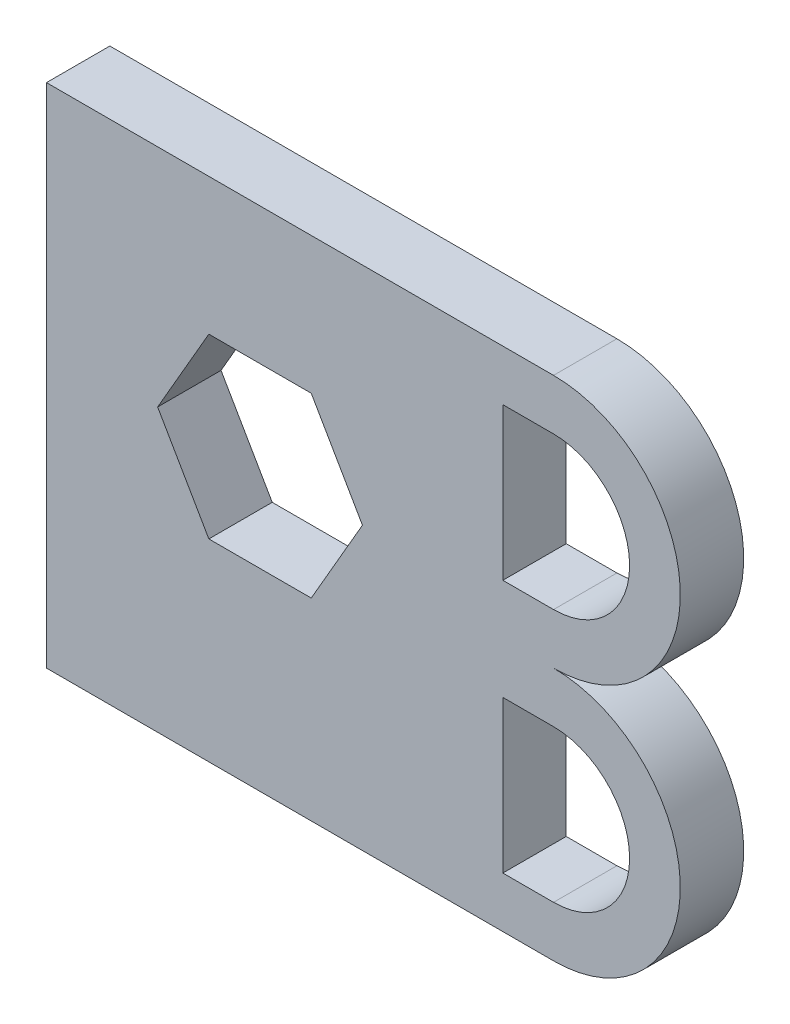
ISO-10303-21;
HEADER;
FILE_DESCRIPTION(('STEP AP214'),'2;1');
FILE_NAME('part.step','',(''),(''),'','','');
FILE_SCHEMA(('AUTOMOTIVE_DESIGN { 1 0 10303 214 1 1 1 1 }'));
ENDSEC;
DATA;
#1=APPLICATION_CONTEXT('core data for automotive mechanical design processes');
#2=APPLICATION_PROTOCOL_DEFINITION('international standard','automotive_design',2000,#1);
#3=PRODUCT_CONTEXT('',#1,'mechanical');
#4=PRODUCT('Part','Part','',(#3));
#5=PRODUCT_RELATED_PRODUCT_CATEGORY('part','',(#4));
#6=PRODUCT_DEFINITION_FORMATION('','',#4);
#7=PRODUCT_DEFINITION_CONTEXT('part definition',#1,'design');
#8=PRODUCT_DEFINITION('design','',#6,#7);
#9=PRODUCT_DEFINITION_SHAPE('','',#8);
#10=(LENGTH_UNIT() NAMED_UNIT(*) SI_UNIT(.MILLI.,.METRE.));
#11=(NAMED_UNIT(*) PLANE_ANGLE_UNIT() SI_UNIT($,.RADIAN.));
#12=(NAMED_UNIT(*) SI_UNIT($,.STERADIAN.) SOLID_ANGLE_UNIT());
#13=UNCERTAINTY_MEASURE_WITH_UNIT(LENGTH_MEASURE(1.E-05),#10,'distance_accuracy_value','');
#14=(GEOMETRIC_REPRESENTATION_CONTEXT(3) GLOBAL_UNCERTAINTY_ASSIGNED_CONTEXT((#13)) GLOBAL_UNIT_ASSIGNED_CONTEXT((#10,
#11,#12)) REPRESENTATION_CONTEXT('',''));
#15=CARTESIAN_POINT('',(0.,0.,0.));
#16=DIRECTION('',(0.,0.,1.));
#17=DIRECTION('',(1.,0.,0.));
#18=AXIS2_PLACEMENT_3D('',#15,#16,#17);
#19=CARTESIAN_POINT('',(80.,60.,10.));
#20=DIRECTION('',(0.,0.,-1.));
#21=DIRECTION('',(-1.,0.,0.));
#22=AXIS2_PLACEMENT_3D('',#19,#20,#21);
#23=PLANE('',#22);
#24=DIRECTION('',(-0.500000000000001,0.866025403784438,0.));
#25=VECTOR('',#24,1.);
#26=CARTESIAN_POINT('',(49.8504126900264,44.4502224717156,10.));
#27=LINE('',#26,#25);
#28=CARTESIAN_POINT('',(49.8504126900264,44.4502224717156,10.));
#29=VERTEX_POINT('',#28);
#30=CARTESIAN_POINT('',(41.7726979514501,58.4412348079776,10.));
#31=VERTEX_POINT('',#30);
#32=EDGE_CURVE('E197',#29,#31,#27,.T.);
#33=ORIENTED_EDGE('',*,*,#32,.F.);
#34=DIRECTION('',(0.499999999999995,0.866025403784441,0.));
#35=VECTOR('',#34,1.);
#36=CARTESIAN_POINT('',(41.7726979514503,30.4592101354538,10.));
#37=LINE('',#36,#35);
#38=CARTESIAN_POINT('',(41.7726979514503,30.4592101354538,10.));
#39=VERTEX_POINT('',#38);
#40=EDGE_CURVE('E48',#39,#29,#37,.T.);
#41=ORIENTED_EDGE('',*,*,#40,.F.);
#42=DIRECTION('',(1.,0.,0.));
#43=VECTOR('',#42,1.);
#44=CARTESIAN_POINT('',(25.6172684742979,30.4592101354536,10.));
#45=LINE('',#44,#43);
#46=CARTESIAN_POINT('',(25.6172684742979,30.4592101354536,10.));
#47=VERTEX_POINT('',#46);
#48=EDGE_CURVE('E183',#47,#39,#45,.T.);
#49=ORIENTED_EDGE('',*,*,#48,.F.);
#50=DIRECTION('',(0.500000000000007,-0.866025403784435,0.));
#51=VECTOR('',#50,1.);
#52=CARTESIAN_POINT('',(17.5395537357216,44.4502224717155,10.));
#53=LINE('',#52,#51);
#54=CARTESIAN_POINT('',(17.5395537357216,44.4502224717155,10.));
#55=VERTEX_POINT('',#54);
#56=EDGE_CURVE('E186',#55,#47,#53,.T.);
#57=ORIENTED_EDGE('',*,*,#56,.F.);
#58=DIRECTION('',(-0.499999999999995,-0.866025403784442,0.));
#59=VECTOR('',#58,1.);
#60=CARTESIAN_POINT('',(25.6172684742977,58.4412348079775,10.));
#61=LINE('',#60,#59);
#62=CARTESIAN_POINT('',(25.6172684742977,58.4412348079775,10.));
#63=VERTEX_POINT('',#62);
#64=EDGE_CURVE('E202',#63,#55,#61,.T.);
#65=ORIENTED_EDGE('',*,*,#64,.F.);
#66=DIRECTION('',(-1.,0.,0.));
#67=VECTOR('',#66,1.);
#68=CARTESIAN_POINT('',(41.7726979514501,58.4412348079776,10.));
#69=LINE('',#68,#67);
#70=EDGE_CURVE('E199',#31,#63,#69,.T.);
#71=ORIENTED_EDGE('',*,*,#70,.F.);
#72=EDGE_LOOP('',(#33,#41,#49,#57,#65,#71));
#73=FACE_BOUND('',#72,.T.);
#74=DIRECTION('',(1.,0.,0.));
#75=VECTOR('',#74,1.);
#76=CARTESIAN_POINT('',(80.,7.99999999999999,10.));
#77=LINE('',#76,#75);
#78=CARTESIAN_POINT('',(72.,7.99999999999999,10.));
#79=VERTEX_POINT('',#78);
#80=CARTESIAN_POINT('',(80.,7.99999999999999,10.));
#81=VERTEX_POINT('',#80);
#82=EDGE_CURVE('E248',#79,#81,#77,.T.);
#83=ORIENTED_EDGE('',*,*,#82,.F.);
#84=DIRECTION('',(0.,-1.,0.));
#85=VECTOR('',#84,1.);
#86=CARTESIAN_POINT('',(72.,7.99999999999999,10.));
#87=LINE('',#86,#85);
#88=CARTESIAN_POINT('',(72.,32.,10.));
#89=VERTEX_POINT('',#88);
#90=EDGE_CURVE('E256',#89,#79,#87,.T.);
#91=ORIENTED_EDGE('',*,*,#90,.F.);
#92=DIRECTION('',(-1.,0.,0.));
#93=VECTOR('',#92,1.);
#94=CARTESIAN_POINT('',(72.,32.,10.));
#95=LINE('',#94,#93);
#96=CARTESIAN_POINT('',(80.,32.,10.));
#97=VERTEX_POINT('',#96);
#98=EDGE_CURVE('E253',#97,#89,#95,.T.);
#99=ORIENTED_EDGE('',*,*,#98,.F.);
#100=CARTESIAN_POINT('',(80.,20.,10.));
#101=DIRECTION('',(0.,0.,1.));
#102=DIRECTION('',(-1.,0.,0.));
#103=AXIS2_PLACEMENT_3D('',#100,#101,#102);
#104=CIRCLE('',#103,12.);
#105=EDGE_CURVE('E250',#81,#97,#104,.T.);
#106=ORIENTED_EDGE('',*,*,#105,.F.);
#107=EDGE_LOOP('',(#83,#91,#99,#106));
#108=FACE_BOUND('',#107,.T.);
#109=DIRECTION('',(0.,-1.,0.));
#110=VECTOR('',#109,1.);
#111=CARTESIAN_POINT('',(0.,0.,10.));
#112=LINE('',#111,#110);
#113=CARTESIAN_POINT('',(0.,80.,10.));
#114=VERTEX_POINT('',#113);
#115=CARTESIAN_POINT('',(0.,0.,10.));
#116=VERTEX_POINT('',#115);
#117=EDGE_CURVE('E279',#114,#116,#112,.T.);
#118=ORIENTED_EDGE('',*,*,#117,.T.);
#119=DIRECTION('',(1.,0.,0.));
#120=VECTOR('',#119,1.);
#121=CARTESIAN_POINT('',(0.,0.,10.));
#122=LINE('',#121,#120);
#123=CARTESIAN_POINT('',(80.,0.,10.));
#124=VERTEX_POINT('',#123);
#125=EDGE_CURVE('E282',#116,#124,#122,.T.);
#126=ORIENTED_EDGE('',*,*,#125,.T.);
#127=CARTESIAN_POINT('',(80.,20.,10.));
#128=DIRECTION('',(0.,0.,1.));
#129=DIRECTION('',(1.,0.,0.));
#130=AXIS2_PLACEMENT_3D('',#127,#128,#129);
#131=CIRCLE('',#130,20.);
#132=CARTESIAN_POINT('',(80.,40.,10.));
#133=VERTEX_POINT('',#132);
#134=EDGE_CURVE('E285',#124,#133,#131,.T.);
#135=ORIENTED_EDGE('',*,*,#134,.T.);
#136=CARTESIAN_POINT('',(80.,60.,10.));
#137=DIRECTION('',(0.,0.,1.));
#138=DIRECTION('',(-1.,0.,0.));
#139=AXIS2_PLACEMENT_3D('',#136,#137,#138);
#140=CIRCLE('',#139,20.);
#141=CARTESIAN_POINT('',(80.,80.,10.));
#142=VERTEX_POINT('',#141);
#143=EDGE_CURVE('E287',#133,#142,#140,.T.);
#144=ORIENTED_EDGE('',*,*,#143,.T.);
#145=DIRECTION('',(-1.,0.,0.));
#146=VECTOR('',#145,1.);
#147=CARTESIAN_POINT('',(0.,80.,10.));
#148=LINE('',#147,#146);
#149=EDGE_CURVE('E289',#142,#114,#148,.T.);
#150=ORIENTED_EDGE('',*,*,#149,.T.);
#151=EDGE_LOOP('',(#118,#126,#135,#144,#150));
#152=FACE_BOUND('',#151,.T.);
#153=CARTESIAN_POINT('',(80.,60.,10.));
#154=DIRECTION('',(0.,0.,1.));
#155=DIRECTION('',(1.,0.,0.));
#156=AXIS2_PLACEMENT_3D('',#153,#154,#155);
#157=CIRCLE('',#156,12.);
#158=CARTESIAN_POINT('',(80.,48.,10.));
#159=VERTEX_POINT('',#158);
#160=CARTESIAN_POINT('',(80.,72.,10.));
#161=VERTEX_POINT('',#160);
#162=EDGE_CURVE('E217',#159,#161,#157,.T.);
#163=ORIENTED_EDGE('',*,*,#162,.F.);
#164=DIRECTION('',(1.,0.,0.));
#165=VECTOR('',#164,1.);
#166=CARTESIAN_POINT('',(72.,48.,10.));
#167=LINE('',#166,#165);
#168=CARTESIAN_POINT('',(72.,48.,10.));
#169=VERTEX_POINT('',#168);
#170=EDGE_CURVE('E225',#169,#159,#167,.T.);
#171=ORIENTED_EDGE('',*,*,#170,.F.);
#172=DIRECTION('',(0.,-1.,0.));
#173=VECTOR('',#172,1.);
#174=CARTESIAN_POINT('',(72.,72.,10.));
#175=LINE('',#174,#173);
#176=CARTESIAN_POINT('',(72.,72.,10.));
#177=VERTEX_POINT('',#176);
#178=EDGE_CURVE('E222',#177,#169,#175,.T.);
#179=ORIENTED_EDGE('',*,*,#178,.F.);
#180=DIRECTION('',(-1.,0.,0.));
#181=VECTOR('',#180,1.);
#182=CARTESIAN_POINT('',(80.,72.,10.));
#183=LINE('',#182,#181);
#184=EDGE_CURVE('E219',#161,#177,#183,.T.);
#185=ORIENTED_EDGE('',*,*,#184,.F.);
#186=EDGE_LOOP('',(#163,#171,#179,#185));
#187=FACE_BOUND('',#186,.T.);
#188=ADVANCED_FACE('F33',(#73,#108,#152,#187),#23,.F.);
#189=CARTESIAN_POINT('',(80.,60.,0.));
#190=DIRECTION('',(0.,0.,-1.));
#191=DIRECTION('',(-1.,0.,0.));
#192=AXIS2_PLACEMENT_3D('',#189,#190,#191);
#193=PLANE('',#192);
#194=DIRECTION('',(0.499999999999995,0.866025403784441,0.));
#195=VECTOR('',#194,1.);
#196=CARTESIAN_POINT('',(41.7726979514503,30.4592101354538,0.));
#197=LINE('',#196,#195);
#198=CARTESIAN_POINT('',(41.7726979514503,30.4592101354538,0.));
#199=VERTEX_POINT('',#198);
#200=CARTESIAN_POINT('',(49.8504126900264,44.4502224717156,0.));
#201=VERTEX_POINT('',#200);
#202=EDGE_CURVE('E166',#199,#201,#197,.T.);
#203=ORIENTED_EDGE('',*,*,#202,.T.);
#204=DIRECTION('',(-0.500000000000001,0.866025403784438,0.));
#205=VECTOR('',#204,1.);
#206=CARTESIAN_POINT('',(49.8504126900264,44.4502224717156,0.));
#207=LINE('',#206,#205);
#208=CARTESIAN_POINT('',(41.7726979514501,58.4412348079776,0.));
#209=VERTEX_POINT('',#208);
#210=EDGE_CURVE('E175',#201,#209,#207,.T.);
#211=ORIENTED_EDGE('',*,*,#210,.T.);
#212=DIRECTION('',(-1.,0.,0.));
#213=VECTOR('',#212,1.);
#214=CARTESIAN_POINT('',(41.7726979514501,58.4412348079776,0.));
#215=LINE('',#214,#213);
#216=CARTESIAN_POINT('',(25.6172684742977,58.4412348079775,0.));
#217=VERTEX_POINT('',#216);
#218=EDGE_CURVE('E56',#209,#217,#215,.T.);
#219=ORIENTED_EDGE('',*,*,#218,.T.);
#220=DIRECTION('',(-0.499999999999995,-0.866025403784442,0.));
#221=VECTOR('',#220,1.);
#222=CARTESIAN_POINT('',(25.6172684742977,58.4412348079775,0.));
#223=LINE('',#222,#221);
#224=CARTESIAN_POINT('',(17.5395537357216,44.4502224717155,0.));
#225=VERTEX_POINT('',#224);
#226=EDGE_CURVE('E190',#217,#225,#223,.T.);
#227=ORIENTED_EDGE('',*,*,#226,.T.);
#228=DIRECTION('',(0.500000000000007,-0.866025403784435,0.));
#229=VECTOR('',#228,1.);
#230=CARTESIAN_POINT('',(17.5395537357216,44.4502224717155,0.));
#231=LINE('',#230,#229);
#232=CARTESIAN_POINT('',(25.6172684742979,30.4592101354536,0.));
#233=VERTEX_POINT('',#232);
#234=EDGE_CURVE('E193',#225,#233,#231,.T.);
#235=ORIENTED_EDGE('',*,*,#234,.T.);
#236=DIRECTION('',(1.,0.,0.));
#237=VECTOR('',#236,1.);
#238=CARTESIAN_POINT('',(25.6172684742979,30.4592101354536,0.));
#239=LINE('',#238,#237);
#240=EDGE_CURVE('E172',#233,#199,#239,.T.);
#241=ORIENTED_EDGE('',*,*,#240,.T.);
#242=EDGE_LOOP('',(#203,#211,#219,#227,#235,#241));
#243=FACE_BOUND('',#242,.T.);
#244=DIRECTION('',(0.,-1.,0.));
#245=VECTOR('',#244,1.);
#246=CARTESIAN_POINT('',(0.,0.,0.));
#247=LINE('',#246,#245);
#248=CARTESIAN_POINT('',(0.,80.,0.));
#249=VERTEX_POINT('',#248);
#250=CARTESIAN_POINT('',(0.,0.,0.));
#251=VERTEX_POINT('',#250);
#252=EDGE_CURVE('E278',#249,#251,#247,.T.);
#253=ORIENTED_EDGE('',*,*,#252,.F.);
#254=DIRECTION('',(-1.,0.,0.));
#255=VECTOR('',#254,1.);
#256=CARTESIAN_POINT('',(0.,80.,0.));
#257=LINE('',#256,#255);
#258=CARTESIAN_POINT('',(80.,80.,0.));
#259=VERTEX_POINT('',#258);
#260=EDGE_CURVE('E283',#259,#249,#257,.T.);
#261=ORIENTED_EDGE('',*,*,#260,.F.);
#262=CARTESIAN_POINT('',(80.,60.,0.));
#263=DIRECTION('',(0.,0.,1.));
#264=DIRECTION('',(-1.,0.,0.));
#265=AXIS2_PLACEMENT_3D('',#262,#263,#264);
#266=CIRCLE('',#265,20.);
#267=CARTESIAN_POINT('',(80.,40.,0.));
#268=VERTEX_POINT('',#267);
#269=EDGE_CURVE('E298',#268,#259,#266,.T.);
#270=ORIENTED_EDGE('',*,*,#269,.F.);
#271=CARTESIAN_POINT('',(80.,20.,0.));
#272=DIRECTION('',(0.,0.,1.));
#273=DIRECTION('',(1.,0.,0.));
#274=AXIS2_PLACEMENT_3D('',#271,#272,#273);
#275=CIRCLE('',#274,20.);
#276=CARTESIAN_POINT('',(80.,0.,0.));
#277=VERTEX_POINT('',#276);
#278=EDGE_CURVE('E296',#277,#268,#275,.T.);
#279=ORIENTED_EDGE('',*,*,#278,.F.);
#280=DIRECTION('',(1.,0.,0.));
#281=VECTOR('',#280,1.);
#282=CARTESIAN_POINT('',(0.,0.,0.));
#283=LINE('',#282,#281);
#284=EDGE_CURVE('E294',#251,#277,#283,.T.);
#285=ORIENTED_EDGE('',*,*,#284,.F.);
#286=EDGE_LOOP('',(#253,#261,#270,#279,#285));
#287=FACE_BOUND('',#286,.T.);
#288=DIRECTION('',(0.,-1.,0.));
#289=VECTOR('',#288,1.);
#290=CARTESIAN_POINT('',(72.,7.99999999999999,0.));
#291=LINE('',#290,#289);
#292=CARTESIAN_POINT('',(72.,32.,0.));
#293=VERTEX_POINT('',#292);
#294=CARTESIAN_POINT('',(72.,7.99999999999999,0.));
#295=VERTEX_POINT('',#294);
#296=EDGE_CURVE('E251',#293,#295,#291,.T.);
#297=ORIENTED_EDGE('',*,*,#296,.T.);
#298=DIRECTION('',(1.,0.,0.));
#299=VECTOR('',#298,1.);
#300=CARTESIAN_POINT('',(80.,7.99999999999999,0.));
#301=LINE('',#300,#299);
#302=CARTESIAN_POINT('',(80.,7.99999999999999,0.));
#303=VERTEX_POINT('',#302);
#304=EDGE_CURVE('E247',#295,#303,#301,.T.);
#305=ORIENTED_EDGE('',*,*,#304,.T.);
#306=CARTESIAN_POINT('',(80.,20.,0.));
#307=DIRECTION('',(0.,0.,1.));
#308=DIRECTION('',(-1.,0.,0.));
#309=AXIS2_PLACEMENT_3D('',#306,#307,#308);
#310=CIRCLE('',#309,12.);
#311=CARTESIAN_POINT('',(80.,32.,0.));
#312=VERTEX_POINT('',#311);
#313=EDGE_CURVE('E261',#303,#312,#310,.T.);
#314=ORIENTED_EDGE('',*,*,#313,.T.);
#315=DIRECTION('',(-1.,0.,0.));
#316=VECTOR('',#315,1.);
#317=CARTESIAN_POINT('',(72.,32.,0.));
#318=LINE('',#317,#316);
#319=EDGE_CURVE('E264',#312,#293,#318,.T.);
#320=ORIENTED_EDGE('',*,*,#319,.T.);
#321=EDGE_LOOP('',(#297,#305,#314,#320));
#322=FACE_BOUND('',#321,.T.);
#323=DIRECTION('',(1.,0.,0.));
#324=VECTOR('',#323,1.);
#325=CARTESIAN_POINT('',(72.,48.,0.));
#326=LINE('',#325,#324);
#327=CARTESIAN_POINT('',(72.,48.,0.));
#328=VERTEX_POINT('',#327);
#329=CARTESIAN_POINT('',(80.,48.,0.));
#330=VERTEX_POINT('',#329);
#331=EDGE_CURVE('E220',#328,#330,#326,.T.);
#332=ORIENTED_EDGE('',*,*,#331,.T.);
#333=CARTESIAN_POINT('',(80.,60.,0.));
#334=DIRECTION('',(0.,0.,1.));
#335=DIRECTION('',(1.,0.,0.));
#336=AXIS2_PLACEMENT_3D('',#333,#334,#335);
#337=CIRCLE('',#336,12.);
#338=CARTESIAN_POINT('',(80.,72.,0.));
#339=VERTEX_POINT('',#338);
#340=EDGE_CURVE('E209',#330,#339,#337,.T.);
#341=ORIENTED_EDGE('',*,*,#340,.T.);
#342=DIRECTION('',(-1.,0.,0.));
#343=VECTOR('',#342,1.);
#344=CARTESIAN_POINT('',(80.,72.,0.));
#345=LINE('',#344,#343);
#346=CARTESIAN_POINT('',(72.,72.,0.));
#347=VERTEX_POINT('',#346);
#348=EDGE_CURVE('E230',#339,#347,#345,.T.);
#349=ORIENTED_EDGE('',*,*,#348,.T.);
#350=DIRECTION('',(0.,-1.,0.));
#351=VECTOR('',#350,1.);
#352=CARTESIAN_POINT('',(72.,72.,0.));
#353=LINE('',#352,#351);
#354=EDGE_CURVE('E233',#347,#328,#353,.T.);
#355=ORIENTED_EDGE('',*,*,#354,.T.);
#356=EDGE_LOOP('',(#332,#341,#349,#355));
#357=FACE_BOUND('',#356,.T.);
#358=ADVANCED_FACE('F179',(#243,#287,#322,#357),#193,.T.);
#359=CARTESIAN_POINT('',(0.,0.,10.));
#360=DIRECTION('',(1.,0.,0.));
#361=DIRECTION('',(0.,0.,-1.));
#362=AXIS2_PLACEMENT_3D('',#359,#360,#361);
#363=PLANE('',#362);
#364=ORIENTED_EDGE('',*,*,#252,.T.);
#365=DIRECTION('',(0.,0.,-1.));
#366=VECTOR('',#365,1.);
#367=CARTESIAN_POINT('',(0.,0.,10.));
#368=LINE('',#367,#366);
#369=EDGE_CURVE('E11',#116,#251,#368,.T.);
#370=ORIENTED_EDGE('',*,*,#369,.F.);
#371=ORIENTED_EDGE('',*,*,#117,.F.);
#372=DIRECTION('',(0.,0.,-1.));
#373=VECTOR('',#372,1.);
#374=CARTESIAN_POINT('',(0.,80.,10.));
#375=LINE('',#374,#373);
#376=EDGE_CURVE('E291',#114,#249,#375,.T.);
#377=ORIENTED_EDGE('',*,*,#376,.T.);
#378=EDGE_LOOP('',(#364,#370,#371,#377));
#379=FACE_BOUND('',#378,.T.);
#380=ADVANCED_FACE('F35',(#379),#363,.F.);
#381=CARTESIAN_POINT('',(0.,0.,10.));
#382=DIRECTION('',(0.,1.,0.));
#383=DIRECTION('',(0.,0.,1.));
#384=AXIS2_PLACEMENT_3D('',#381,#382,#383);
#385=PLANE('',#384);
#386=ORIENTED_EDGE('',*,*,#284,.T.);
#387=DIRECTION('',(0.,0.,-1.));
#388=VECTOR('',#387,1.);
#389=CARTESIAN_POINT('',(80.,0.,10.));
#390=LINE('',#389,#388);
#391=EDGE_CURVE('E41',#124,#277,#390,.T.);
#392=ORIENTED_EDGE('',*,*,#391,.F.);
#393=ORIENTED_EDGE('',*,*,#125,.F.);
#394=ORIENTED_EDGE('',*,*,#369,.T.);
#395=EDGE_LOOP('',(#386,#392,#393,#394));
#396=FACE_BOUND('',#395,.T.);
#397=ADVANCED_FACE('F332',(#396),#385,.F.);
#398=CARTESIAN_POINT('',(80.,20.,10.));
#399=DIRECTION('',(0.,0.,-1.));
#400=DIRECTION('',(-1.,0.,0.));
#401=AXIS2_PLACEMENT_3D('',#398,#399,#400);
#402=CYLINDRICAL_SURFACE('',#401,20.);
#403=ORIENTED_EDGE('',*,*,#278,.T.);
#404=DIRECTION('',(0.,0.,-1.));
#405=VECTOR('',#404,1.);
#406=CARTESIAN_POINT('',(80.,40.,10.));
#407=LINE('',#406,#405);
#408=EDGE_CURVE('E306',#133,#268,#407,.T.);
#409=ORIENTED_EDGE('',*,*,#408,.F.);
#410=ORIENTED_EDGE('',*,*,#134,.F.);
#411=ORIENTED_EDGE('',*,*,#391,.T.);
#412=EDGE_LOOP('',(#403,#409,#410,#411));
#413=FACE_BOUND('',#412,.T.);
#414=ADVANCED_FACE('F313',(#413),#402,.T.);
#415=CARTESIAN_POINT('',(80.,60.,10.));
#416=DIRECTION('',(0.,0.,-1.));
#417=DIRECTION('',(-1.,0.,0.));
#418=AXIS2_PLACEMENT_3D('',#415,#416,#417);
#419=CYLINDRICAL_SURFACE('',#418,20.);
#420=ORIENTED_EDGE('',*,*,#269,.T.);
#421=DIRECTION('',(0.,0.,-1.));
#422=VECTOR('',#421,1.);
#423=CARTESIAN_POINT('',(80.,80.,10.));
#424=LINE('',#423,#422);
#425=EDGE_CURVE('E303',#142,#259,#424,.T.);
#426=ORIENTED_EDGE('',*,*,#425,.F.);
#427=ORIENTED_EDGE('',*,*,#143,.F.);
#428=ORIENTED_EDGE('',*,*,#408,.T.);
#429=EDGE_LOOP('',(#420,#426,#427,#428));
#430=FACE_BOUND('',#429,.T.);
#431=ADVANCED_FACE('F322',(#430),#419,.T.);
#432=CARTESIAN_POINT('',(0.,80.,10.));
#433=DIRECTION('',(0.,-1.,0.));
#434=DIRECTION('',(1.,0.,0.));
#435=AXIS2_PLACEMENT_3D('',#432,#433,#434);
#436=PLANE('',#435);
#437=ORIENTED_EDGE('',*,*,#260,.T.);
#438=ORIENTED_EDGE('',*,*,#376,.F.);
#439=ORIENTED_EDGE('',*,*,#149,.F.);
#440=ORIENTED_EDGE('',*,*,#425,.T.);
#441=EDGE_LOOP('',(#437,#438,#439,#440));
#442=FACE_BOUND('',#441,.T.);
#443=ADVANCED_FACE('F326',(#442),#436,.F.);
#444=CARTESIAN_POINT('',(80.,7.99999999999999,10.));
#445=DIRECTION('',(0.,1.,0.));
#446=DIRECTION('',(-1.,0.,0.));
#447=AXIS2_PLACEMENT_3D('',#444,#445,#446);
#448=PLANE('',#447);
#449=ORIENTED_EDGE('',*,*,#304,.F.);
#450=DIRECTION('',(0.,0.,-1.));
#451=VECTOR('',#450,1.);
#452=CARTESIAN_POINT('',(72.,7.99999999999999,10.));
#453=LINE('',#452,#451);
#454=EDGE_CURVE('E258',#79,#295,#453,.T.);
#455=ORIENTED_EDGE('',*,*,#454,.F.);
#456=ORIENTED_EDGE('',*,*,#82,.T.);
#457=DIRECTION('',(0.,0.,-1.));
#458=VECTOR('',#457,1.);
#459=CARTESIAN_POINT('',(80.,7.99999999999999,10.));
#460=LINE('',#459,#458);
#461=EDGE_CURVE('E275',#81,#303,#460,.T.);
#462=ORIENTED_EDGE('',*,*,#461,.T.);
#463=EDGE_LOOP('',(#449,#455,#456,#462));
#464=FACE_BOUND('',#463,.T.);
#465=ADVANCED_FACE('F347',(#464),#448,.T.);
#466=CARTESIAN_POINT('',(80.,20.,10.));
#467=DIRECTION('',(0.,0.,-1.));
#468=DIRECTION('',(-1.,0.,0.));
#469=AXIS2_PLACEMENT_3D('',#466,#467,#468);
#470=CYLINDRICAL_SURFACE('',#469,12.);
#471=ORIENTED_EDGE('',*,*,#313,.F.);
#472=ORIENTED_EDGE('',*,*,#461,.F.);
#473=ORIENTED_EDGE('',*,*,#105,.T.);
#474=DIRECTION('',(0.,0.,-1.));
#475=VECTOR('',#474,1.);
#476=CARTESIAN_POINT('',(80.,32.,10.));
#477=LINE('',#476,#475);
#478=EDGE_CURVE('E273',#97,#312,#477,.T.);
#479=ORIENTED_EDGE('',*,*,#478,.T.);
#480=EDGE_LOOP('',(#471,#472,#473,#479));
#481=FACE_BOUND('',#480,.T.);
#482=ADVANCED_FACE('F373',(#481),#470,.F.);
#483=CARTESIAN_POINT('',(72.,32.,10.));
#484=DIRECTION('',(0.,-1.,0.));
#485=DIRECTION('',(0.,0.,-1.));
#486=AXIS2_PLACEMENT_3D('',#483,#484,#485);
#487=PLANE('',#486);
#488=ORIENTED_EDGE('',*,*,#319,.F.);
#489=ORIENTED_EDGE('',*,*,#478,.F.);
#490=ORIENTED_EDGE('',*,*,#98,.T.);
#491=DIRECTION('',(0.,0.,-1.));
#492=VECTOR('',#491,1.);
#493=CARTESIAN_POINT('',(72.,32.,10.));
#494=LINE('',#493,#492);
#495=EDGE_CURVE('E271',#89,#293,#494,.T.);
#496=ORIENTED_EDGE('',*,*,#495,.T.);
#497=EDGE_LOOP('',(#488,#489,#490,#496));
#498=FACE_BOUND('',#497,.T.);
#499=ADVANCED_FACE('F380',(#498),#487,.T.);
#500=CARTESIAN_POINT('',(72.,7.99999999999999,10.));
#501=DIRECTION('',(1.,0.,0.));
#502=DIRECTION('',(0.,0.,-1.));
#503=AXIS2_PLACEMENT_3D('',#500,#501,#502);
#504=PLANE('',#503);
#505=ORIENTED_EDGE('',*,*,#296,.F.);
#506=ORIENTED_EDGE('',*,*,#495,.F.);
#507=ORIENTED_EDGE('',*,*,#90,.T.);
#508=ORIENTED_EDGE('',*,*,#454,.T.);
#509=EDGE_LOOP('',(#505,#506,#507,#508));
#510=FACE_BOUND('',#509,.T.);
#511=ADVANCED_FACE('F387',(#510),#504,.T.);
#512=CARTESIAN_POINT('',(80.,60.,10.));
#513=DIRECTION('',(0.,0.,-1.));
#514=DIRECTION('',(-1.,0.,0.));
#515=AXIS2_PLACEMENT_3D('',#512,#513,#514);
#516=CYLINDRICAL_SURFACE('',#515,12.);
#517=ORIENTED_EDGE('',*,*,#340,.F.);
#518=DIRECTION('',(0.,0.,-1.));
#519=VECTOR('',#518,1.);
#520=CARTESIAN_POINT('',(80.,48.,10.));
#521=LINE('',#520,#519);
#522=EDGE_CURVE('E227',#159,#330,#521,.T.);
#523=ORIENTED_EDGE('',*,*,#522,.F.);
#524=ORIENTED_EDGE('',*,*,#162,.T.);
#525=DIRECTION('',(0.,0.,-1.));
#526=VECTOR('',#525,1.);
#527=CARTESIAN_POINT('',(80.,72.,10.));
#528=LINE('',#527,#526);
#529=EDGE_CURVE('E244',#161,#339,#528,.T.);
#530=ORIENTED_EDGE('',*,*,#529,.T.);
#531=EDGE_LOOP('',(#517,#523,#524,#530));
#532=FACE_BOUND('',#531,.T.);
#533=ADVANCED_FACE('F395',(#532),#516,.F.);
#534=CARTESIAN_POINT('',(80.,72.,10.));
#535=DIRECTION('',(0.,-1.,0.));
#536=DIRECTION('',(0.,0.,-1.));
#537=AXIS2_PLACEMENT_3D('',#534,#535,#536);
#538=PLANE('',#537);
#539=ORIENTED_EDGE('',*,*,#348,.F.);
#540=ORIENTED_EDGE('',*,*,#529,.F.);
#541=ORIENTED_EDGE('',*,*,#184,.T.);
#542=DIRECTION('',(0.,0.,-1.));
#543=VECTOR('',#542,1.);
#544=CARTESIAN_POINT('',(72.,72.,10.));
#545=LINE('',#544,#543);
#546=EDGE_CURVE('E242',#177,#347,#545,.T.);
#547=ORIENTED_EDGE('',*,*,#546,.T.);
#548=EDGE_LOOP('',(#539,#540,#541,#547));
#549=FACE_BOUND('',#548,.T.);
#550=ADVANCED_FACE('F403',(#549),#538,.T.);
#551=CARTESIAN_POINT('',(72.,72.,10.));
#552=DIRECTION('',(1.,0.,0.));
#553=DIRECTION('',(0.,0.,-1.));
#554=AXIS2_PLACEMENT_3D('',#551,#552,#553);
#555=PLANE('',#554);
#556=ORIENTED_EDGE('',*,*,#354,.F.);
#557=ORIENTED_EDGE('',*,*,#546,.F.);
#558=ORIENTED_EDGE('',*,*,#178,.T.);
#559=DIRECTION('',(0.,0.,-1.));
#560=VECTOR('',#559,1.);
#561=CARTESIAN_POINT('',(72.,48.,10.));
#562=LINE('',#561,#560);
#563=EDGE_CURVE('E240',#169,#328,#562,.T.);
#564=ORIENTED_EDGE('',*,*,#563,.T.);
#565=EDGE_LOOP('',(#556,#557,#558,#564));
#566=FACE_BOUND('',#565,.T.);
#567=ADVANCED_FACE('F411',(#566),#555,.T.);
#568=CARTESIAN_POINT('',(72.,48.,10.));
#569=DIRECTION('',(0.,1.,0.));
#570=DIRECTION('',(0.,0.,1.));
#571=AXIS2_PLACEMENT_3D('',#568,#569,#570);
#572=PLANE('',#571);
#573=ORIENTED_EDGE('',*,*,#331,.F.);
#574=ORIENTED_EDGE('',*,*,#563,.F.);
#575=ORIENTED_EDGE('',*,*,#170,.T.);
#576=ORIENTED_EDGE('',*,*,#522,.T.);
#577=EDGE_LOOP('',(#573,#574,#575,#576));
#578=FACE_BOUND('',#577,.T.);
#579=ADVANCED_FACE('F419',(#578),#572,.T.);
#580=CARTESIAN_POINT('',(41.7726979514503,30.4592101354538,0.));
#581=DIRECTION('',(0.866025403784441,-0.499999999999995,0.));
#582=DIRECTION('',(0.499999999999995,0.866025403784441,0.));
#583=AXIS2_PLACEMENT_3D('',#580,#581,#582);
#584=PLANE('',#583);
#585=ORIENTED_EDGE('',*,*,#40,.T.);
#586=DIRECTION('',(0.,0.,1.));
#587=VECTOR('',#586,1.);
#588=CARTESIAN_POINT('',(49.8504126900264,44.4502224717156,0.));
#589=LINE('',#588,#587);
#590=EDGE_CURVE('E162',#201,#29,#589,.T.);
#591=ORIENTED_EDGE('',*,*,#590,.F.);
#592=ORIENTED_EDGE('',*,*,#202,.F.);
#593=DIRECTION('',(0.,0.,1.));
#594=VECTOR('',#593,1.);
#595=CARTESIAN_POINT('',(41.7726979514503,30.4592101354538,0.));
#596=LINE('',#595,#594);
#597=EDGE_CURVE('E207',#199,#39,#596,.T.);
#598=ORIENTED_EDGE('',*,*,#597,.T.);
#599=EDGE_LOOP('',(#585,#591,#592,#598));
#600=FACE_BOUND('',#599,.T.);
#601=ADVANCED_FACE('F164',(#600),#584,.F.);
#602=CARTESIAN_POINT('',(25.6172684742979,30.4592101354536,0.));
#603=DIRECTION('',(0.,-1.,0.));
#604=DIRECTION('',(1.,0.,0.));
#605=AXIS2_PLACEMENT_3D('',#602,#603,#604);
#606=PLANE('',#605);
#607=ORIENTED_EDGE('',*,*,#48,.T.);
#608=ORIENTED_EDGE('',*,*,#597,.F.);
#609=ORIENTED_EDGE('',*,*,#240,.F.);
#610=DIRECTION('',(0.,0.,1.));
#611=VECTOR('',#610,1.);
#612=CARTESIAN_POINT('',(25.6172684742979,30.4592101354536,0.));
#613=LINE('',#612,#611);
#614=EDGE_CURVE('E210',#233,#47,#613,.T.);
#615=ORIENTED_EDGE('',*,*,#614,.T.);
#616=EDGE_LOOP('',(#607,#608,#609,#615));
#617=FACE_BOUND('',#616,.T.);
#618=ADVANCED_FACE('F434',(#617),#606,.F.);
#619=CARTESIAN_POINT('',(17.5395537357216,44.4502224717155,0.));
#620=DIRECTION('',(-0.866025403784435,-0.500000000000007,0.));
#621=DIRECTION('',(0.500000000000007,-0.866025403784435,0.));
#622=AXIS2_PLACEMENT_3D('',#619,#620,#621);
#623=PLANE('',#622);
#624=ORIENTED_EDGE('',*,*,#56,.T.);
#625=ORIENTED_EDGE('',*,*,#614,.F.);
#626=ORIENTED_EDGE('',*,*,#234,.F.);
#627=DIRECTION('',(0.,0.,1.));
#628=VECTOR('',#627,1.);
#629=CARTESIAN_POINT('',(17.5395537357216,44.4502224717155,0.));
#630=LINE('',#629,#628);
#631=EDGE_CURVE('E212',#225,#55,#630,.T.);
#632=ORIENTED_EDGE('',*,*,#631,.T.);
#633=EDGE_LOOP('',(#624,#625,#626,#632));
#634=FACE_BOUND('',#633,.T.);
#635=ADVANCED_FACE('F442',(#634),#623,.F.);
#636=CARTESIAN_POINT('',(25.6172684742977,58.4412348079775,0.));
#637=DIRECTION('',(-0.866025403784442,0.499999999999995,0.));
#638=DIRECTION('',(-0.499999999999995,-0.866025403784442,0.));
#639=AXIS2_PLACEMENT_3D('',#636,#637,#638);
#640=PLANE('',#639);
#641=ORIENTED_EDGE('',*,*,#64,.T.);
#642=ORIENTED_EDGE('',*,*,#631,.F.);
#643=ORIENTED_EDGE('',*,*,#226,.F.);
#644=DIRECTION('',(0.,0.,1.));
#645=VECTOR('',#644,1.);
#646=CARTESIAN_POINT('',(25.6172684742977,58.4412348079775,0.));
#647=LINE('',#646,#645);
#648=EDGE_CURVE('E214',#217,#63,#647,.T.);
#649=ORIENTED_EDGE('',*,*,#648,.T.);
#650=EDGE_LOOP('',(#641,#642,#643,#649));
#651=FACE_BOUND('',#650,.T.);
#652=ADVANCED_FACE('F450',(#651),#640,.F.);
#653=CARTESIAN_POINT('',(41.7726979514501,58.4412348079776,0.));
#654=DIRECTION('',(0.,1.,0.));
#655=DIRECTION('',(-1.,0.,0.));
#656=AXIS2_PLACEMENT_3D('',#653,#654,#655);
#657=PLANE('',#656);
#658=ORIENTED_EDGE('',*,*,#70,.T.);
#659=ORIENTED_EDGE('',*,*,#648,.F.);
#660=ORIENTED_EDGE('',*,*,#218,.F.);
#661=DIRECTION('',(0.,0.,1.));
#662=VECTOR('',#661,1.);
#663=CARTESIAN_POINT('',(41.7726979514501,58.4412348079776,0.));
#664=LINE('',#663,#662);
#665=EDGE_CURVE('E171',#209,#31,#664,.T.);
#666=ORIENTED_EDGE('',*,*,#665,.T.);
#667=EDGE_LOOP('',(#658,#659,#660,#666));
#668=FACE_BOUND('',#667,.T.);
#669=ADVANCED_FACE('F458',(#668),#657,.F.);
#670=CARTESIAN_POINT('',(49.8504126900264,44.4502224717156,0.));
#671=DIRECTION('',(0.866025403784438,0.500000000000001,0.));
#672=DIRECTION('',(-0.500000000000001,0.866025403784438,0.));
#673=AXIS2_PLACEMENT_3D('',#670,#671,#672);
#674=PLANE('',#673);
#675=ORIENTED_EDGE('',*,*,#32,.T.);
#676=ORIENTED_EDGE('',*,*,#665,.F.);
#677=ORIENTED_EDGE('',*,*,#210,.F.);
#678=ORIENTED_EDGE('',*,*,#590,.T.);
#679=EDGE_LOOP('',(#675,#676,#677,#678));
#680=FACE_BOUND('',#679,.T.);
#681=ADVANCED_FACE('F176',(#680),#674,.F.);
#682=CLOSED_SHELL('',(#188,#358,#380,#397,#414,#431,#443,#465,#482,#499,#511,#533,#550,#567,
#579,#601,#618,#635,#652,#669,#681));
#683=MANIFOLD_SOLID_BREP('B2',#682);
#684=ADVANCED_BREP_SHAPE_REPRESENTATION('',(#18,#683),#14);
#685=SHAPE_DEFINITION_REPRESENTATION(#9,#684);
ENDSEC;
END-ISO-10303-21;
